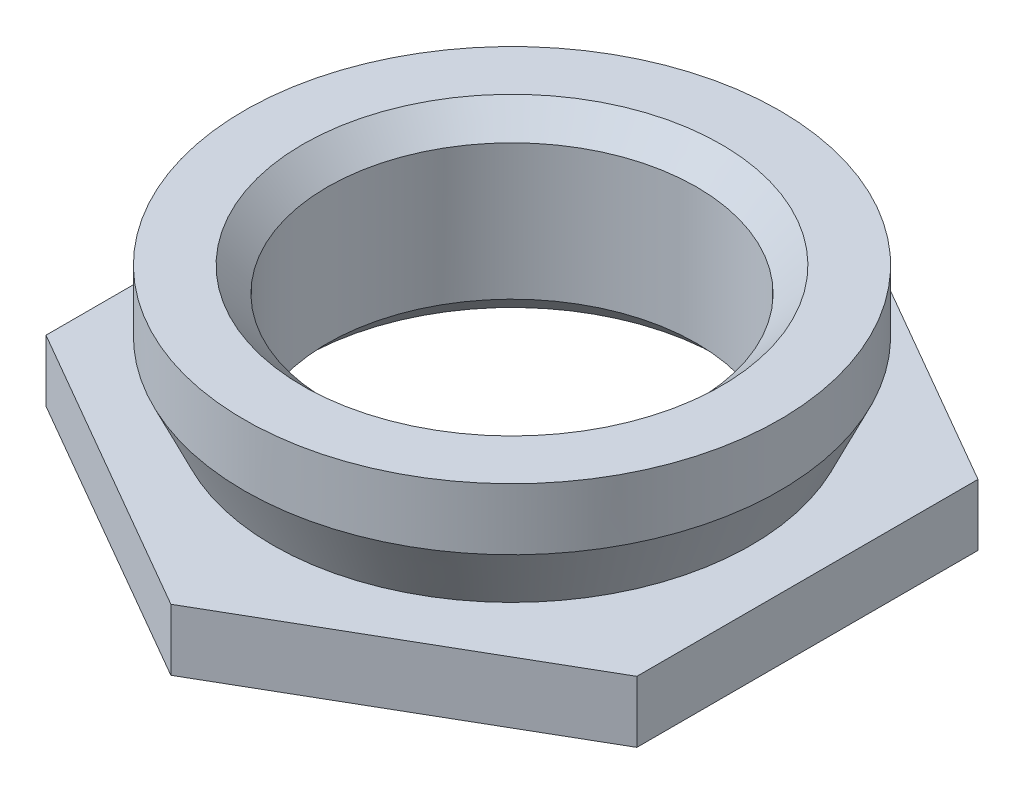
ISO-10303-21;
HEADER;
FILE_DESCRIPTION(('STEP AP214'),'2;1');
FILE_NAME('part.step','',(''),(''),'','','');
FILE_SCHEMA(('AUTOMOTIVE_DESIGN { 1 0 10303 214 1 1 1 1 }'));
ENDSEC;
DATA;
#1=APPLICATION_CONTEXT('core data for automotive mechanical design processes');
#2=APPLICATION_PROTOCOL_DEFINITION('international standard','automotive_design',2000,#1);
#3=PRODUCT_CONTEXT('',#1,'mechanical');
#4=PRODUCT('Part','Part','',(#3));
#5=PRODUCT_RELATED_PRODUCT_CATEGORY('part','',(#4));
#6=PRODUCT_DEFINITION_FORMATION('','',#4);
#7=PRODUCT_DEFINITION_CONTEXT('part definition',#1,'design');
#8=PRODUCT_DEFINITION('design','',#6,#7);
#9=PRODUCT_DEFINITION_SHAPE('','',#8);
#10=(LENGTH_UNIT() NAMED_UNIT(*) SI_UNIT(.MILLI.,.METRE.));
#11=(NAMED_UNIT(*) PLANE_ANGLE_UNIT() SI_UNIT($,.RADIAN.));
#12=(NAMED_UNIT(*) SI_UNIT($,.STERADIAN.) SOLID_ANGLE_UNIT());
#13=UNCERTAINTY_MEASURE_WITH_UNIT(LENGTH_MEASURE(1.E-05),#10,'distance_accuracy_value','');
#14=(GEOMETRIC_REPRESENTATION_CONTEXT(3) GLOBAL_UNCERTAINTY_ASSIGNED_CONTEXT((#13)) GLOBAL_UNIT_ASSIGNED_CONTEXT((#10,
#11,#12)) REPRESENTATION_CONTEXT('',''));
#15=CARTESIAN_POINT('',(0.,0.,0.));
#16=DIRECTION('',(0.,0.,1.));
#17=DIRECTION('',(1.,0.,0.));
#18=AXIS2_PLACEMENT_3D('',#15,#16,#17);
#19=CARTESIAN_POINT('',(0.,1.5,-1.5));
#20=DIRECTION('',(0.,1.,0.));
#21=DIRECTION('',(0.,0.,1.));
#22=AXIS2_PLACEMENT_3D('',#19,#20,#21);
#23=PLANE('',#22);
#24=CARTESIAN_POINT('',(0.,1.5,0.));
#25=DIRECTION('',(0.,-1.,0.));
#26=DIRECTION('',(0.,0.,-1.));
#27=AXIS2_PLACEMENT_3D('',#24,#25,#26);
#28=CIRCLE('',#27,2.175);
#29=CARTESIAN_POINT('',(0.,1.5,-2.175));
#30=VERTEX_POINT('',#29);
#31=EDGE_CURVE('E20',#30,#30,#28,.T.);
#32=ORIENTED_EDGE('',*,*,#31,.F.);
#33=EDGE_LOOP('',(#32));
#34=FACE_BOUND('',#33,.T.);
#35=CARTESIAN_POINT('',(0.,1.50000000002137,0.));
#36=DIRECTION('',(0.,1.,0.));
#37=DIRECTION('',(-1.,0.,0.));
#38=AXIS2_PLACEMENT_3D('',#35,#36,#37);
#39=CIRCLE('',#38,1.69999999997117);
#40=CARTESIAN_POINT('',(-1.69999999997117,1.50000000002137,0.));
#41=VERTEX_POINT('',#40);
#42=EDGE_CURVE('E107',#41,#41,#39,.F.);
#43=ORIENTED_EDGE('',*,*,#42,.T.);
#44=EDGE_LOOP('',(#43));
#45=FACE_BOUND('',#44,.T.);
#46=ADVANCED_FACE('F17',(#34,#45),#23,.T.);
#47=CARTESIAN_POINT('',(0.,0.,0.));
#48=DIRECTION('',(0.,-1.,0.));
#49=DIRECTION('',(0.,0.,-1.));
#50=AXIS2_PLACEMENT_3D('',#47,#48,#49);
#51=CYLINDRICAL_SURFACE('',#50,2.175);
#52=ORIENTED_EDGE('',*,*,#31,.T.);
#53=EDGE_LOOP('',(#52));
#54=FACE_BOUND('',#53,.T.);
#55=CARTESIAN_POINT('',(0.,0.999999999976353,0.));
#56=DIRECTION('',(0.,1.,0.));
#57=DIRECTION('',(0.,0.,1.));
#58=AXIS2_PLACEMENT_3D('',#55,#56,#57);
#59=CIRCLE('',#58,2.17500000002246);
#60=CARTESIAN_POINT('',(0.,0.999999999976353,2.17500000002246));
#61=VERTEX_POINT('',#60);
#62=EDGE_CURVE('E104',#61,#61,#59,.F.);
#63=ORIENTED_EDGE('',*,*,#62,.F.);
#64=EDGE_LOOP('',(#63));
#65=FACE_BOUND('',#64,.T.);
#66=ADVANCED_FACE('F119',(#54,#65),#51,.T.);
#67=CARTESIAN_POINT('',(0.,1.50000000002137,0.));
#68=DIRECTION('',(0.,1.,0.));
#69=DIRECTION('',(-1.,0.,0.));
#70=AXIS2_PLACEMENT_3D('',#67,#68,#69);
#71=CONICAL_SURFACE('',#70,1.69999999997117,0.785398163397448);
#72=CARTESIAN_POINT('',(0.,1.3,0.));
#73=DIRECTION('',(0.,-1.,0.));
#74=DIRECTION('',(0.,0.,-1.));
#75=AXIS2_PLACEMENT_3D('',#72,#73,#74);
#76=CIRCLE('',#75,1.5);
#77=CARTESIAN_POINT('',(0.,1.3,-1.5));
#78=VERTEX_POINT('',#77);
#79=EDGE_CURVE('E101',#78,#78,#76,.T.);
#80=ORIENTED_EDGE('',*,*,#79,.T.);
#81=EDGE_LOOP('',(#80));
#82=FACE_BOUND('',#81,.T.);
#83=ORIENTED_EDGE('',*,*,#42,.F.);
#84=EDGE_LOOP('',(#83));
#85=FACE_BOUND('',#84,.T.);
#86=ADVANCED_FACE('F127',(#82,#85),#71,.F.);
#87=CARTESIAN_POINT('',(0.,0.999999999976353,0.));
#88=DIRECTION('',(0.,1.,0.));
#89=DIRECTION('',(0.,0.,1.));
#90=AXIS2_PLACEMENT_3D('',#87,#88,#89);
#91=CONICAL_SURFACE('',#90,2.17500000002246,0.436332313045054);
#92=CARTESIAN_POINT('',(0.,0.499999999988176,0.));
#93=DIRECTION('',(0.,1.,0.));
#94=DIRECTION('',(0.,0.,1.));
#95=AXIS2_PLACEMENT_3D('',#92,#93,#94);
#96=CIRCLE('',#95,1.94184617092219);
#97=CARTESIAN_POINT('',(0.,0.499999999988176,1.94184617092219));
#98=VERTEX_POINT('',#97);
#99=EDGE_CURVE('E100',#98,#98,#96,.T.);
#100=ORIENTED_EDGE('',*,*,#99,.T.);
#101=EDGE_LOOP('',(#100));
#102=FACE_BOUND('',#101,.T.);
#103=ORIENTED_EDGE('',*,*,#62,.T.);
#104=EDGE_LOOP('',(#103));
#105=FACE_BOUND('',#104,.T.);
#106=ADVANCED_FACE('F165',(#102,#105),#91,.T.);
#107=CARTESIAN_POINT('',(0.,0.5,0.));
#108=DIRECTION('',(0.,-1.,0.));
#109=DIRECTION('',(0.,0.,-1.));
#110=AXIS2_PLACEMENT_3D('',#107,#108,#109);
#111=CYLINDRICAL_SURFACE('',#110,1.5);
#112=ORIENTED_EDGE('',*,*,#79,.F.);
#113=EDGE_LOOP('',(#112));
#114=FACE_BOUND('',#113,.T.);
#115=CARTESIAN_POINT('',(0.,0.200000000006639,0.));
#116=DIRECTION('',(0.,-1.,0.));
#117=DIRECTION('',(0.,0.,-1.));
#118=AXIS2_PLACEMENT_3D('',#115,#116,#117);
#119=CIRCLE('',#118,1.50000000002137);
#120=CARTESIAN_POINT('',(0.,0.200000000006639,-1.50000000002137));
#121=VERTEX_POINT('',#120);
#122=EDGE_CURVE('E87',#121,#121,#119,.T.);
#123=ORIENTED_EDGE('',*,*,#122,.T.);
#124=EDGE_LOOP('',(#123));
#125=FACE_BOUND('',#124,.T.);
#126=ADVANCED_FACE('F162',(#114,#125),#111,.F.);
#127=CARTESIAN_POINT('',(2.4,0.5,1.3856406460551));
#128=DIRECTION('',(0.,-1.,0.));
#129=DIRECTION('',(0.,0.,-1.));
#130=AXIS2_PLACEMENT_3D('',#127,#128,#129);
#131=PLANE('',#130);
#132=DIRECTION('',(0.866025403784439,0.,0.5));
#133=VECTOR('',#132,1.);
#134=CARTESIAN_POINT('',(2.4,0.5,-1.3856406460551));
#135=LINE('',#134,#133);
#136=CARTESIAN_POINT('',(2.4,0.5,-1.3856406460551));
#137=VERTEX_POINT('',#136);
#138=CARTESIAN_POINT('',(0.,0.5,-2.7712812921102));
#139=VERTEX_POINT('',#138);
#140=EDGE_CURVE('E282',#137,#139,#135,.F.);
#141=ORIENTED_EDGE('',*,*,#140,.T.);
#142=DIRECTION('',(0.866025403784439,0.,-0.5));
#143=VECTOR('',#142,1.);
#144=CARTESIAN_POINT('',(0.,0.5,-2.7712812921102));
#145=LINE('',#144,#143);
#146=CARTESIAN_POINT('',(-2.4,0.5,-1.3856406460551));
#147=VERTEX_POINT('',#146);
#148=EDGE_CURVE('E277',#139,#147,#145,.F.);
#149=ORIENTED_EDGE('',*,*,#148,.T.);
#150=DIRECTION('',(0.,0.,-1.));
#151=VECTOR('',#150,1.);
#152=CARTESIAN_POINT('',(-2.4,0.5,-1.3856406460551));
#153=LINE('',#152,#151);
#154=CARTESIAN_POINT('',(-2.4,0.5,1.3856406460551));
#155=VERTEX_POINT('',#154);
#156=EDGE_CURVE('E272',#147,#155,#153,.F.);
#157=ORIENTED_EDGE('',*,*,#156,.T.);
#158=DIRECTION('',(-0.866025403784439,0.,-0.5));
#159=VECTOR('',#158,1.);
#160=CARTESIAN_POINT('',(-2.4,0.5,1.3856406460551));
#161=LINE('',#160,#159);
#162=CARTESIAN_POINT('',(0.,0.5,2.7712812921102));
#163=VERTEX_POINT('',#162);
#164=EDGE_CURVE('E68',#155,#163,#161,.F.);
#165=ORIENTED_EDGE('',*,*,#164,.T.);
#166=DIRECTION('',(-0.866025403784439,0.,0.5));
#167=VECTOR('',#166,1.);
#168=CARTESIAN_POINT('',(0.,0.5,2.7712812921102));
#169=LINE('',#168,#167);
#170=CARTESIAN_POINT('',(2.4,0.5,1.3856406460551));
#171=VERTEX_POINT('',#170);
#172=EDGE_CURVE('E70',#163,#171,#169,.F.);
#173=ORIENTED_EDGE('',*,*,#172,.T.);
#174=DIRECTION('',(0.,0.,1.));
#175=VECTOR('',#174,1.);
#176=CARTESIAN_POINT('',(2.4,0.5,1.3856406460551));
#177=LINE('',#176,#175);
#178=EDGE_CURVE('E74',#171,#137,#177,.F.);
#179=ORIENTED_EDGE('',*,*,#178,.T.);
#180=EDGE_LOOP('',(#141,#149,#157,#165,#173,#179));
#181=FACE_BOUND('',#180,.T.);
#182=ORIENTED_EDGE('',*,*,#99,.F.);
#183=EDGE_LOOP('',(#182));
#184=FACE_BOUND('',#183,.T.);
#185=ADVANCED_FACE('F72',(#181,#184),#131,.F.);
#186=CARTESIAN_POINT('',(0.,0.,0.));
#187=DIRECTION('',(0.,-1.,0.));
#188=DIRECTION('',(0.,0.,-1.));
#189=AXIS2_PLACEMENT_3D('',#186,#187,#188);
#190=CONICAL_SURFACE('',#189,1.70000000002801,0.785398163397448);
#191=ORIENTED_EDGE('',*,*,#122,.F.);
#192=EDGE_LOOP('',(#191));
#193=FACE_BOUND('',#192,.T.);
#194=CARTESIAN_POINT('',(0.,0.,0.));
#195=DIRECTION('',(0.,-1.,0.));
#196=DIRECTION('',(0.,0.,-1.));
#197=AXIS2_PLACEMENT_3D('',#194,#195,#196);
#198=CIRCLE('',#197,1.70000000002801);
#199=CARTESIAN_POINT('',(0.,0.,-1.70000000002801));
#200=VERTEX_POINT('',#199);
#201=EDGE_CURVE('E108',#200,#200,#198,.F.);
#202=ORIENTED_EDGE('',*,*,#201,.F.);
#203=EDGE_LOOP('',(#202));
#204=FACE_BOUND('',#203,.T.);
#205=ADVANCED_FACE('F156',(#193,#204),#190,.F.);
#206=CARTESIAN_POINT('',(2.4,0.5,1.3856406460551));
#207=DIRECTION('',(-1.,0.,0.));
#208=DIRECTION('',(0.,0.,1.));
#209=AXIS2_PLACEMENT_3D('',#206,#207,#208);
#210=PLANE('',#209);
#211=DIRECTION('',(0.,1.,0.));
#212=VECTOR('',#211,1.);
#213=CARTESIAN_POINT('',(2.4,0.5,-1.3856406460551));
#214=LINE('',#213,#212);
#215=CARTESIAN_POINT('',(2.4,0.,-1.3856406460551));
#216=VERTEX_POINT('',#215);
#217=EDGE_CURVE('E85',#216,#137,#214,.T.);
#218=ORIENTED_EDGE('',*,*,#217,.T.);
#219=ORIENTED_EDGE('',*,*,#178,.F.);
#220=DIRECTION('',(0.,1.,0.));
#221=VECTOR('',#220,1.);
#222=CARTESIAN_POINT('',(2.4,0.5,1.3856406460551));
#223=LINE('',#222,#221);
#224=CARTESIAN_POINT('',(2.4,0.,1.3856406460551));
#225=VERTEX_POINT('',#224);
#226=EDGE_CURVE('E79',#171,#225,#223,.F.);
#227=ORIENTED_EDGE('',*,*,#226,.T.);
#228=DIRECTION('',(0.,0.,-1.));
#229=VECTOR('',#228,1.);
#230=CARTESIAN_POINT('',(2.4,0.,1.3856406460551));
#231=LINE('',#230,#229);
#232=EDGE_CURVE('E111',#216,#225,#231,.F.);
#233=ORIENTED_EDGE('',*,*,#232,.F.);
#234=EDGE_LOOP('',(#218,#219,#227,#233));
#235=FACE_BOUND('',#234,.T.);
#236=ADVANCED_FACE('F82',(#235),#210,.F.);
#237=CARTESIAN_POINT('',(0.,0.5,2.7712812921102));
#238=DIRECTION('',(-0.5,0.,-0.866025403784439));
#239=DIRECTION('',(-0.866025403784439,0.,0.5));
#240=AXIS2_PLACEMENT_3D('',#237,#238,#239);
#241=PLANE('',#240);
#242=ORIENTED_EDGE('',*,*,#226,.F.);
#243=ORIENTED_EDGE('',*,*,#172,.F.);
#244=DIRECTION('',(0.,1.,0.));
#245=VECTOR('',#244,1.);
#246=CARTESIAN_POINT('',(0.,0.5,2.7712812921102));
#247=LINE('',#246,#245);
#248=CARTESIAN_POINT('',(0.,0.,2.7712812921102));
#249=VERTEX_POINT('',#248);
#250=EDGE_CURVE('E94',#163,#249,#247,.F.);
#251=ORIENTED_EDGE('',*,*,#250,.T.);
#252=DIRECTION('',(-0.866025403784439,0.,0.5));
#253=VECTOR('',#252,1.);
#254=CARTESIAN_POINT('',(2.4,0.,1.3856406460551));
#255=LINE('',#254,#253);
#256=EDGE_CURVE('E91',#225,#249,#255,.T.);
#257=ORIENTED_EDGE('',*,*,#256,.F.);
#258=EDGE_LOOP('',(#242,#243,#251,#257));
#259=FACE_BOUND('',#258,.T.);
#260=ADVANCED_FACE('F89',(#259),#241,.F.);
#261=CARTESIAN_POINT('',(-2.4,0.5,1.3856406460551));
#262=DIRECTION('',(0.5,0.,-0.866025403784439));
#263=DIRECTION('',(-0.866025403784439,0.,-0.5));
#264=AXIS2_PLACEMENT_3D('',#261,#262,#263);
#265=PLANE('',#264);
#266=ORIENTED_EDGE('',*,*,#250,.F.);
#267=ORIENTED_EDGE('',*,*,#164,.F.);
#268=DIRECTION('',(0.,1.,0.));
#269=VECTOR('',#268,1.);
#270=CARTESIAN_POINT('',(-2.4,0.5,1.3856406460551));
#271=LINE('',#270,#269);
#272=CARTESIAN_POINT('',(-2.4,0.,1.3856406460551));
#273=VERTEX_POINT('',#272);
#274=EDGE_CURVE('E273',#155,#273,#271,.F.);
#275=ORIENTED_EDGE('',*,*,#274,.T.);
#276=DIRECTION('',(-0.866025403784439,0.,-0.5));
#277=VECTOR('',#276,1.);
#278=CARTESIAN_POINT('',(0.,0.,2.7712812921102));
#279=LINE('',#278,#277);
#280=EDGE_CURVE('E271',#249,#273,#279,.T.);
#281=ORIENTED_EDGE('',*,*,#280,.F.);
#282=EDGE_LOOP('',(#266,#267,#275,#281));
#283=FACE_BOUND('',#282,.T.);
#284=ADVANCED_FACE('F147',(#283),#265,.F.);
#285=CARTESIAN_POINT('',(-2.4,0.5,-1.3856406460551));
#286=DIRECTION('',(1.,0.,0.));
#287=DIRECTION('',(0.,0.,-1.));
#288=AXIS2_PLACEMENT_3D('',#285,#286,#287);
#289=PLANE('',#288);
#290=ORIENTED_EDGE('',*,*,#274,.F.);
#291=ORIENTED_EDGE('',*,*,#156,.F.);
#292=DIRECTION('',(0.,1.,0.));
#293=VECTOR('',#292,1.);
#294=CARTESIAN_POINT('',(-2.4,0.5,-1.3856406460551));
#295=LINE('',#294,#293);
#296=CARTESIAN_POINT('',(-2.4,0.,-1.3856406460551));
#297=VERTEX_POINT('',#296);
#298=EDGE_CURVE('E279',#147,#297,#295,.F.);
#299=ORIENTED_EDGE('',*,*,#298,.T.);
#300=DIRECTION('',(0.,0.,-1.));
#301=VECTOR('',#300,1.);
#302=CARTESIAN_POINT('',(-2.4,0.,1.3856406460551));
#303=LINE('',#302,#301);
#304=EDGE_CURVE('E288',#273,#297,#303,.T.);
#305=ORIENTED_EDGE('',*,*,#304,.F.);
#306=EDGE_LOOP('',(#290,#291,#299,#305));
#307=FACE_BOUND('',#306,.T.);
#308=ADVANCED_FACE('F144',(#307),#289,.F.);
#309=CARTESIAN_POINT('',(0.,0.5,-2.7712812921102));
#310=DIRECTION('',(0.5,0.,0.866025403784439));
#311=DIRECTION('',(0.866025403784439,0.,-0.5));
#312=AXIS2_PLACEMENT_3D('',#309,#310,#311);
#313=PLANE('',#312);
#314=ORIENTED_EDGE('',*,*,#298,.F.);
#315=ORIENTED_EDGE('',*,*,#148,.F.);
#316=DIRECTION('',(0.,1.,0.));
#317=VECTOR('',#316,1.);
#318=CARTESIAN_POINT('',(0.,0.5,-2.7712812921102));
#319=LINE('',#318,#317);
#320=CARTESIAN_POINT('',(0.,0.,-2.7712812921102));
#321=VERTEX_POINT('',#320);
#322=EDGE_CURVE('E35',#139,#321,#319,.F.);
#323=ORIENTED_EDGE('',*,*,#322,.T.);
#324=DIRECTION('',(0.866025403784439,0.,-0.5));
#325=VECTOR('',#324,1.);
#326=CARTESIAN_POINT('',(-2.4,0.,-1.3856406460551));
#327=LINE('',#326,#325);
#328=EDGE_CURVE('E26',#297,#321,#327,.T.);
#329=ORIENTED_EDGE('',*,*,#328,.F.);
#330=EDGE_LOOP('',(#314,#315,#323,#329));
#331=FACE_BOUND('',#330,.T.);
#332=ADVANCED_FACE('F136',(#331),#313,.F.);
#333=CARTESIAN_POINT('',(2.4,0.5,-1.3856406460551));
#334=DIRECTION('',(-0.5,0.,0.866025403784439));
#335=DIRECTION('',(0.866025403784439,0.,0.5));
#336=AXIS2_PLACEMENT_3D('',#333,#334,#335);
#337=PLANE('',#336);
#338=ORIENTED_EDGE('',*,*,#322,.F.);
#339=ORIENTED_EDGE('',*,*,#140,.F.);
#340=ORIENTED_EDGE('',*,*,#217,.F.);
#341=DIRECTION('',(0.866025403784438,0.,0.5));
#342=VECTOR('',#341,1.);
#343=CARTESIAN_POINT('',(0.,0.,-2.7712812921102));
#344=LINE('',#343,#342);
#345=EDGE_CURVE('E11',#321,#216,#344,.T.);
#346=ORIENTED_EDGE('',*,*,#345,.F.);
#347=EDGE_LOOP('',(#338,#339,#340,#346));
#348=FACE_BOUND('',#347,.T.);
#349=ADVANCED_FACE('F130',(#348),#337,.F.);
#350=CARTESIAN_POINT('',(2.4,0.,1.3856406460551));
#351=DIRECTION('',(0.,-1.,0.));
#352=DIRECTION('',(0.,0.,-1.));
#353=AXIS2_PLACEMENT_3D('',#350,#351,#352);
#354=PLANE('',#353);
#355=ORIENTED_EDGE('',*,*,#328,.T.);
#356=ORIENTED_EDGE('',*,*,#345,.T.);
#357=ORIENTED_EDGE('',*,*,#232,.T.);
#358=ORIENTED_EDGE('',*,*,#256,.T.);
#359=ORIENTED_EDGE('',*,*,#280,.T.);
#360=ORIENTED_EDGE('',*,*,#304,.T.);
#361=EDGE_LOOP('',(#355,#356,#357,#358,#359,#360));
#362=FACE_BOUND('',#361,.T.);
#363=ORIENTED_EDGE('',*,*,#201,.T.);
#364=EDGE_LOOP('',(#363));
#365=FACE_BOUND('',#364,.T.);
#366=ADVANCED_FACE('F128',(#362,#365),#354,.T.);
#367=CLOSED_SHELL('',(#46,#66,#86,#106,#126,#185,#205,#236,#260,#284,#308,#332,#349,#366));
#368=MANIFOLD_SOLID_BREP('B1',#367);
#369=ADVANCED_BREP_SHAPE_REPRESENTATION('',(#18,#368),#14);
#370=SHAPE_DEFINITION_REPRESENTATION(#9,#369);
ENDSEC;
END-ISO-10303-21;
